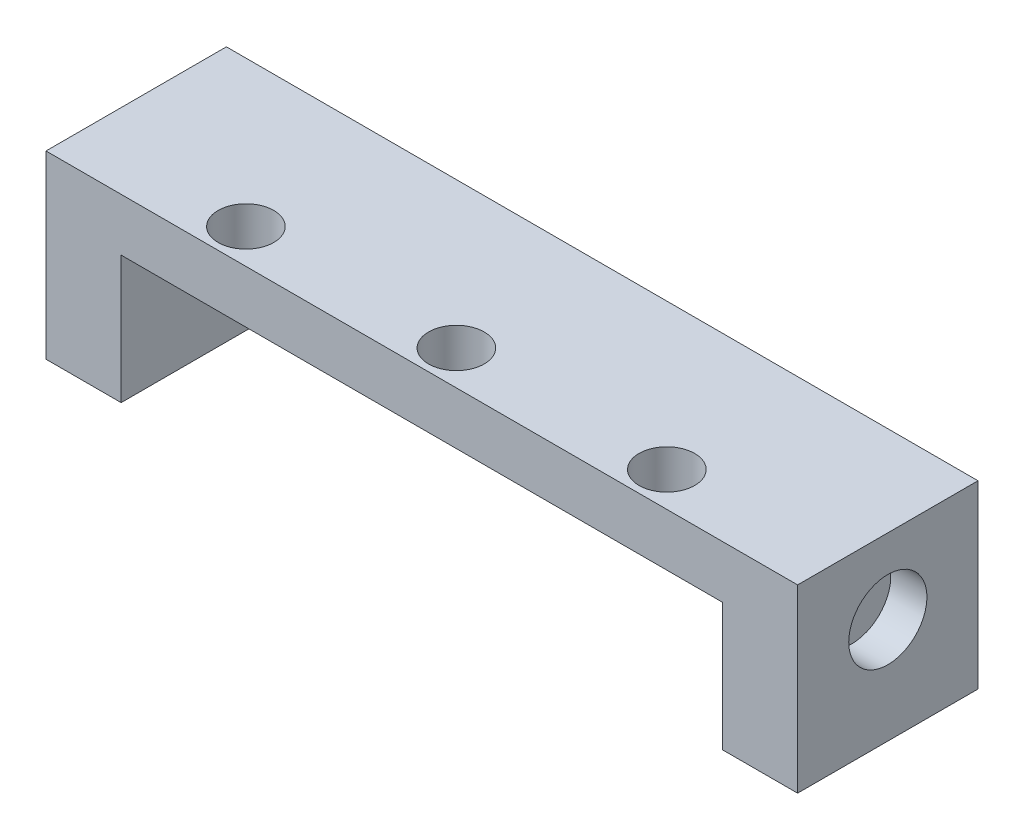
ISO-10303-21;
HEADER;
FILE_DESCRIPTION(('STEP AP214'),'2;1');
FILE_NAME('part.step','',(''),(''),'','','');
FILE_SCHEMA(('AUTOMOTIVE_DESIGN { 1 0 10303 214 1 1 1 1 }'));
ENDSEC;
DATA;
#1=APPLICATION_CONTEXT('core data for automotive mechanical design processes');
#2=APPLICATION_PROTOCOL_DEFINITION('international standard','automotive_design',2000,#1);
#3=PRODUCT_CONTEXT('',#1,'mechanical');
#4=PRODUCT('Part','Part','',(#3));
#5=PRODUCT_RELATED_PRODUCT_CATEGORY('part','',(#4));
#6=PRODUCT_DEFINITION_FORMATION('','',#4);
#7=PRODUCT_DEFINITION_CONTEXT('part definition',#1,'design');
#8=PRODUCT_DEFINITION('design','',#6,#7);
#9=PRODUCT_DEFINITION_SHAPE('','',#8);
#10=(LENGTH_UNIT() NAMED_UNIT(*) SI_UNIT(.MILLI.,.METRE.));
#11=(NAMED_UNIT(*) PLANE_ANGLE_UNIT() SI_UNIT($,.RADIAN.));
#12=(NAMED_UNIT(*) SI_UNIT($,.STERADIAN.) SOLID_ANGLE_UNIT());
#13=UNCERTAINTY_MEASURE_WITH_UNIT(LENGTH_MEASURE(1.E-05),#10,'distance_accuracy_value','');
#14=(GEOMETRIC_REPRESENTATION_CONTEXT(3) GLOBAL_UNCERTAINTY_ASSIGNED_CONTEXT((#13)) GLOBAL_UNIT_ASSIGNED_CONTEXT((#10,
#11,#12)) REPRESENTATION_CONTEXT('',''));
#15=CARTESIAN_POINT('',(0.,0.,0.));
#16=DIRECTION('',(0.,0.,1.));
#17=DIRECTION('',(1.,0.,0.));
#18=AXIS2_PLACEMENT_3D('',#15,#16,#17);
#19=CARTESIAN_POINT('',(0.,0.,12.));
#20=DIRECTION('',(0.,0.,-1.));
#21=DIRECTION('',(-1.,0.,0.));
#22=AXIS2_PLACEMENT_3D('',#19,#20,#21);
#23=PLANE('',#22);
#24=DIRECTION('',(-1.,0.,0.));
#25=VECTOR('',#24,1.);
#26=CARTESIAN_POINT('',(0.,59.,12.));
#27=LINE('',#26,#25);
#28=CARTESIAN_POINT('',(52.,59.,12.));
#29=VERTEX_POINT('',#28);
#30=CARTESIAN_POINT('',(2.,59.,12.));
#31=VERTEX_POINT('',#30);
#32=EDGE_CURVE('E11',#29,#31,#27,.T.);
#33=ORIENTED_EDGE('',*,*,#32,.T.);
#34=DIRECTION('',(0.,-1.,0.));
#35=VECTOR('',#34,1.);
#36=CARTESIAN_POINT('',(2.,59.,12.));
#37=LINE('',#36,#35);
#38=CARTESIAN_POINT('',(2.,47.,12.));
#39=VERTEX_POINT('',#38);
#40=EDGE_CURVE('E105',#31,#39,#37,.T.);
#41=ORIENTED_EDGE('',*,*,#40,.T.);
#42=DIRECTION('',(1.,0.,0.));
#43=VECTOR('',#42,1.);
#44=CARTESIAN_POINT('',(2.,47.,12.));
#45=LINE('',#44,#43);
#46=CARTESIAN_POINT('',(7.,47.,12.));
#47=VERTEX_POINT('',#46);
#48=EDGE_CURVE('E134',#39,#47,#45,.T.);
#49=ORIENTED_EDGE('',*,*,#48,.T.);
#50=DIRECTION('',(0.,-1.,0.));
#51=VECTOR('',#50,1.);
#52=CARTESIAN_POINT('',(7.,59.,12.));
#53=LINE('',#52,#51);
#54=CARTESIAN_POINT('',(7.,55.5,12.));
#55=VERTEX_POINT('',#54);
#56=EDGE_CURVE('E135',#55,#47,#53,.T.);
#57=ORIENTED_EDGE('',*,*,#56,.F.);
#58=DIRECTION('',(-1.,0.,0.));
#59=VECTOR('',#58,1.);
#60=CARTESIAN_POINT('',(7.,55.5,12.));
#61=LINE('',#60,#59);
#62=CARTESIAN_POINT('',(47.,55.5,12.));
#63=VERTEX_POINT('',#62);
#64=EDGE_CURVE('E193',#63,#55,#61,.T.);
#65=ORIENTED_EDGE('',*,*,#64,.F.);
#66=DIRECTION('',(0.,-1.,0.));
#67=VECTOR('',#66,1.);
#68=CARTESIAN_POINT('',(47.,59.,12.));
#69=LINE('',#68,#67);
#70=CARTESIAN_POINT('',(47.,47.,12.));
#71=VERTEX_POINT('',#70);
#72=EDGE_CURVE('E150',#63,#71,#69,.T.);
#73=ORIENTED_EDGE('',*,*,#72,.T.);
#74=DIRECTION('',(-1.,0.,0.));
#75=VECTOR('',#74,1.);
#76=CARTESIAN_POINT('',(52.,47.,12.));
#77=LINE('',#76,#75);
#78=CARTESIAN_POINT('',(52.,47.,12.));
#79=VERTEX_POINT('',#78);
#80=EDGE_CURVE('E176',#79,#71,#77,.T.);
#81=ORIENTED_EDGE('',*,*,#80,.F.);
#82=DIRECTION('',(0.,-1.,0.));
#83=VECTOR('',#82,1.);
#84=CARTESIAN_POINT('',(52.,59.,12.));
#85=LINE('',#84,#83);
#86=EDGE_CURVE('E109',#29,#79,#85,.T.);
#87=ORIENTED_EDGE('',*,*,#86,.F.);
#88=EDGE_LOOP('',(#33,#41,#49,#57,#65,#73,#81,#87));
#89=FACE_BOUND('',#88,.T.);
#90=ADVANCED_FACE('F39',(#89),#23,.F.);
#91=CARTESIAN_POINT('',(0.,0.,0.));
#92=DIRECTION('',(0.,0.,-1.));
#93=DIRECTION('',(-1.,0.,0.));
#94=AXIS2_PLACEMENT_3D('',#91,#92,#93);
#95=PLANE('',#94);
#96=DIRECTION('',(-1.,0.,0.));
#97=VECTOR('',#96,1.);
#98=CARTESIAN_POINT('',(7.,55.5,0.));
#99=LINE('',#98,#97);
#100=CARTESIAN_POINT('',(47.,55.5,0.));
#101=VERTEX_POINT('',#100);
#102=CARTESIAN_POINT('',(7.,55.5,0.));
#103=VERTEX_POINT('',#102);
#104=EDGE_CURVE('E197',#101,#103,#99,.T.);
#105=ORIENTED_EDGE('',*,*,#104,.T.);
#106=DIRECTION('',(0.,1.,0.));
#107=VECTOR('',#106,1.);
#108=CARTESIAN_POINT('',(7.,59.,0.));
#109=LINE('',#108,#107);
#110=CARTESIAN_POINT('',(7.,47.,0.));
#111=VERTEX_POINT('',#110);
#112=EDGE_CURVE('E138',#111,#103,#109,.T.);
#113=ORIENTED_EDGE('',*,*,#112,.F.);
#114=DIRECTION('',(1.,0.,0.));
#115=VECTOR('',#114,1.);
#116=CARTESIAN_POINT('',(2.,47.,0.));
#117=LINE('',#116,#115);
#118=CARTESIAN_POINT('',(2.,47.,0.));
#119=VERTEX_POINT('',#118);
#120=EDGE_CURVE('E147',#119,#111,#117,.T.);
#121=ORIENTED_EDGE('',*,*,#120,.F.);
#122=DIRECTION('',(0.,1.,0.));
#123=VECTOR('',#122,1.);
#124=CARTESIAN_POINT('',(2.,59.,0.));
#125=LINE('',#124,#123);
#126=CARTESIAN_POINT('',(2.,59.,0.));
#127=VERTEX_POINT('',#126);
#128=EDGE_CURVE('E126',#119,#127,#125,.T.);
#129=ORIENTED_EDGE('',*,*,#128,.T.);
#130=DIRECTION('',(-1.,0.,0.));
#131=VECTOR('',#130,1.);
#132=CARTESIAN_POINT('',(0.,59.,0.));
#133=LINE('',#132,#131);
#134=CARTESIAN_POINT('',(52.,59.,0.));
#135=VERTEX_POINT('',#134);
#136=EDGE_CURVE('E50',#135,#127,#133,.T.);
#137=ORIENTED_EDGE('',*,*,#136,.F.);
#138=DIRECTION('',(0.,1.,0.));
#139=VECTOR('',#138,1.);
#140=CARTESIAN_POINT('',(52.,59.,0.));
#141=LINE('',#140,#139);
#142=CARTESIAN_POINT('',(52.,47.,0.));
#143=VERTEX_POINT('',#142);
#144=EDGE_CURVE('E157',#143,#135,#141,.T.);
#145=ORIENTED_EDGE('',*,*,#144,.F.);
#146=DIRECTION('',(-1.,0.,0.));
#147=VECTOR('',#146,1.);
#148=CARTESIAN_POINT('',(52.,47.,0.));
#149=LINE('',#148,#147);
#150=CARTESIAN_POINT('',(47.,47.,0.));
#151=VERTEX_POINT('',#150);
#152=EDGE_CURVE('E164',#143,#151,#149,.T.);
#153=ORIENTED_EDGE('',*,*,#152,.T.);
#154=DIRECTION('',(0.,1.,0.));
#155=VECTOR('',#154,1.);
#156=CARTESIAN_POINT('',(47.,59.,0.));
#157=LINE('',#156,#155);
#158=EDGE_CURVE('E154',#151,#101,#157,.T.);
#159=ORIENTED_EDGE('',*,*,#158,.T.);
#160=EDGE_LOOP('',(#105,#113,#121,#129,#137,#145,#153,#159));
#161=FACE_BOUND('',#160,.T.);
#162=ADVANCED_FACE('F236',(#161),#95,.T.);
#163=CARTESIAN_POINT('',(0.,59.,12.));
#164=DIRECTION('',(0.,-1.,0.));
#165=DIRECTION('',(0.,0.,-1.));
#166=AXIS2_PLACEMENT_3D('',#163,#164,#165);
#167=PLANE('',#166);
#168=CARTESIAN_POINT('',(13.,59.,9.69999999999999));
#169=DIRECTION('',(0.,1.,0.));
#170=DIRECTION('',(-1.,0.,0.));
#171=AXIS2_PLACEMENT_3D('',#168,#169,#170);
#172=CIRCLE('',#171,1.85);
#173=CARTESIAN_POINT('',(11.15,59.,9.69999999999999));
#174=VERTEX_POINT('',#173);
#175=EDGE_CURVE('E181',#174,#174,#172,.T.);
#176=ORIENTED_EDGE('',*,*,#175,.F.);
#177=EDGE_LOOP('',(#176));
#178=FACE_BOUND('',#177,.T.);
#179=CARTESIAN_POINT('',(41.,59.0000000000002,9.69999999999999));
#180=DIRECTION('',(0.,1.,0.));
#181=DIRECTION('',(-1.,0.,0.));
#182=AXIS2_PLACEMENT_3D('',#179,#180,#181);
#183=CIRCLE('',#182,1.85);
#184=CARTESIAN_POINT('',(39.15,59.0000000000001,9.69999999999999));
#185=VERTEX_POINT('',#184);
#186=EDGE_CURVE('E186',#185,#185,#183,.T.);
#187=ORIENTED_EDGE('',*,*,#186,.F.);
#188=EDGE_LOOP('',(#187));
#189=FACE_BOUND('',#188,.T.);
#190=CARTESIAN_POINT('',(27.,59.0000000000001,9.69999999999999));
#191=DIRECTION('',(0.,1.,0.));
#192=DIRECTION('',(-1.,0.,0.));
#193=AXIS2_PLACEMENT_3D('',#190,#191,#192);
#194=CIRCLE('',#193,1.85);
#195=CARTESIAN_POINT('',(25.15,59.0000000000001,9.69999999999999));
#196=VERTEX_POINT('',#195);
#197=EDGE_CURVE('E180',#196,#196,#194,.T.);
#198=ORIENTED_EDGE('',*,*,#197,.F.);
#199=EDGE_LOOP('',(#198));
#200=FACE_BOUND('',#199,.T.);
#201=ORIENTED_EDGE('',*,*,#136,.T.);
#202=DIRECTION('',(0.,0.,1.));
#203=VECTOR('',#202,1.);
#204=CARTESIAN_POINT('',(2.,59.,12.));
#205=LINE('',#204,#203);
#206=EDGE_CURVE('E118',#127,#31,#205,.T.);
#207=ORIENTED_EDGE('',*,*,#206,.T.);
#208=ORIENTED_EDGE('',*,*,#32,.F.);
#209=DIRECTION('',(0.,0.,1.));
#210=VECTOR('',#209,1.);
#211=CARTESIAN_POINT('',(52.,59.,12.));
#212=LINE('',#211,#210);
#213=EDGE_CURVE('E161',#135,#29,#212,.T.);
#214=ORIENTED_EDGE('',*,*,#213,.F.);
#215=EDGE_LOOP('',(#201,#207,#208,#214));
#216=FACE_BOUND('',#215,.T.);
#217=ADVANCED_FACE('F41',(#178,#189,#200,#216),#167,.F.);
#218=CARTESIAN_POINT('',(7.,55.5,12.));
#219=DIRECTION('',(0.,-1.,0.));
#220=DIRECTION('',(0.,0.,-1.));
#221=AXIS2_PLACEMENT_3D('',#218,#219,#220);
#222=PLANE('',#221);
#223=CARTESIAN_POINT('',(13.,55.5,9.69999999999999));
#224=DIRECTION('',(0.,-1.,0.));
#225=DIRECTION('',(0.,0.,-1.));
#226=AXIS2_PLACEMENT_3D('',#223,#224,#225);
#227=CIRCLE('',#226,1.85);
#228=CARTESIAN_POINT('',(13.,55.5,7.84999999999999));
#229=VERTEX_POINT('',#228);
#230=EDGE_CURVE('E43',#229,#229,#227,.T.);
#231=ORIENTED_EDGE('',*,*,#230,.F.);
#232=EDGE_LOOP('',(#231));
#233=FACE_BOUND('',#232,.T.);
#234=CARTESIAN_POINT('',(41.,55.5,9.69999999999999));
#235=DIRECTION('',(0.,-1.,0.));
#236=DIRECTION('',(0.,0.,-1.));
#237=AXIS2_PLACEMENT_3D('',#234,#235,#236);
#238=CIRCLE('',#237,1.85);
#239=CARTESIAN_POINT('',(41.,55.5,7.84999999999999));
#240=VERTEX_POINT('',#239);
#241=EDGE_CURVE('E210',#240,#240,#238,.T.);
#242=ORIENTED_EDGE('',*,*,#241,.F.);
#243=EDGE_LOOP('',(#242));
#244=FACE_BOUND('',#243,.T.);
#245=CARTESIAN_POINT('',(27.,55.5,9.69999999999999));
#246=DIRECTION('',(0.,-1.,0.));
#247=DIRECTION('',(0.,0.,-1.));
#248=AXIS2_PLACEMENT_3D('',#245,#246,#247);
#249=CIRCLE('',#248,1.85);
#250=CARTESIAN_POINT('',(27.,55.5,7.84999999999999));
#251=VERTEX_POINT('',#250);
#252=EDGE_CURVE('E185',#251,#251,#249,.T.);
#253=ORIENTED_EDGE('',*,*,#252,.F.);
#254=EDGE_LOOP('',(#253));
#255=FACE_BOUND('',#254,.T.);
#256=ORIENTED_EDGE('',*,*,#104,.F.);
#257=DIRECTION('',(0.,0.,-1.));
#258=VECTOR('',#257,1.);
#259=CARTESIAN_POINT('',(47.,55.5,12.));
#260=LINE('',#259,#258);
#261=EDGE_CURVE('E57',#63,#101,#260,.T.);
#262=ORIENTED_EDGE('',*,*,#261,.F.);
#263=ORIENTED_EDGE('',*,*,#64,.T.);
#264=DIRECTION('',(0.,0.,-1.));
#265=VECTOR('',#264,1.);
#266=CARTESIAN_POINT('',(7.,55.5,12.));
#267=LINE('',#266,#265);
#268=EDGE_CURVE('E196',#55,#103,#267,.T.);
#269=ORIENTED_EDGE('',*,*,#268,.T.);
#270=EDGE_LOOP('',(#256,#262,#263,#269));
#271=FACE_BOUND('',#270,.T.);
#272=ADVANCED_FACE('F222',(#233,#244,#255,#271),#222,.T.);
#273=CARTESIAN_POINT('',(27.,49.0000000000001,9.69999999999999));
#274=DIRECTION('',(0.,1.,0.));
#275=DIRECTION('',(-1.,0.,0.));
#276=AXIS2_PLACEMENT_3D('',#273,#274,#275);
#277=CYLINDRICAL_SURFACE('',#276,1.85);
#278=ORIENTED_EDGE('',*,*,#252,.T.);
#279=EDGE_LOOP('',(#278));
#280=FACE_BOUND('',#279,.T.);
#281=ORIENTED_EDGE('',*,*,#197,.T.);
#282=EDGE_LOOP('',(#281));
#283=FACE_BOUND('',#282,.T.);
#284=ADVANCED_FACE('F225',(#280,#283),#277,.F.);
#285=CARTESIAN_POINT('',(41.,49.0000000000002,9.69999999999999));
#286=DIRECTION('',(0.,1.,0.));
#287=DIRECTION('',(-1.,0.,0.));
#288=AXIS2_PLACEMENT_3D('',#285,#286,#287);
#289=CYLINDRICAL_SURFACE('',#288,1.85);
#290=ORIENTED_EDGE('',*,*,#241,.T.);
#291=EDGE_LOOP('',(#290));
#292=FACE_BOUND('',#291,.T.);
#293=ORIENTED_EDGE('',*,*,#186,.T.);
#294=EDGE_LOOP('',(#293));
#295=FACE_BOUND('',#294,.T.);
#296=ADVANCED_FACE('F267',(#292,#295),#289,.F.);
#297=CARTESIAN_POINT('',(13.,49.,9.69999999999999));
#298=DIRECTION('',(0.,1.,0.));
#299=DIRECTION('',(-1.,0.,0.));
#300=AXIS2_PLACEMENT_3D('',#297,#298,#299);
#301=CYLINDRICAL_SURFACE('',#300,1.85);
#302=ORIENTED_EDGE('',*,*,#230,.T.);
#303=EDGE_LOOP('',(#302));
#304=FACE_BOUND('',#303,.T.);
#305=ORIENTED_EDGE('',*,*,#175,.T.);
#306=EDGE_LOOP('',(#305));
#307=FACE_BOUND('',#306,.T.);
#308=ADVANCED_FACE('F219',(#304,#307),#301,.F.);
#309=CARTESIAN_POINT('',(47.,0.,0.));
#310=DIRECTION('',(1.,0.,0.));
#311=DIRECTION('',(0.,0.,-1.));
#312=AXIS2_PLACEMENT_3D('',#309,#310,#311);
#313=PLANE('',#312);
#314=ORIENTED_EDGE('',*,*,#72,.F.);
#315=ORIENTED_EDGE('',*,*,#261,.T.);
#316=ORIENTED_EDGE('',*,*,#158,.F.);
#317=DIRECTION('',(0.,0.,-1.));
#318=VECTOR('',#317,1.);
#319=CARTESIAN_POINT('',(47.,47.,12.));
#320=LINE('',#319,#318);
#321=EDGE_CURVE('E167',#71,#151,#320,.T.);
#322=ORIENTED_EDGE('',*,*,#321,.F.);
#323=EDGE_LOOP('',(#314,#315,#316,#322));
#324=FACE_BOUND('',#323,.T.);
#325=ADVANCED_FACE('F234',(#324),#313,.F.);
#326=CARTESIAN_POINT('',(52.,47.,12.));
#327=DIRECTION('',(0.,1.,0.));
#328=DIRECTION('',(0.,0.,1.));
#329=AXIS2_PLACEMENT_3D('',#326,#327,#328);
#330=PLANE('',#329);
#331=ORIENTED_EDGE('',*,*,#321,.T.);
#332=ORIENTED_EDGE('',*,*,#152,.F.);
#333=DIRECTION('',(0.,0.,-1.));
#334=VECTOR('',#333,1.);
#335=CARTESIAN_POINT('',(52.,47.,12.));
#336=LINE('',#335,#334);
#337=EDGE_CURVE('E153',#79,#143,#336,.T.);
#338=ORIENTED_EDGE('',*,*,#337,.F.);
#339=ORIENTED_EDGE('',*,*,#80,.T.);
#340=EDGE_LOOP('',(#331,#332,#338,#339));
#341=FACE_BOUND('',#340,.T.);
#342=ADVANCED_FACE('F240',(#341),#330,.F.);
#343=CARTESIAN_POINT('',(52.,0.,0.));
#344=DIRECTION('',(1.,0.,0.));
#345=DIRECTION('',(0.,0.,-1.));
#346=AXIS2_PLACEMENT_3D('',#343,#344,#345);
#347=PLANE('',#346);
#348=CARTESIAN_POINT('',(52.,54.,6.));
#349=DIRECTION('',(-1.,0.,0.));
#350=DIRECTION('',(0.,0.,1.));
#351=AXIS2_PLACEMENT_3D('',#348,#349,#350);
#352=CIRCLE('',#351,2.6);
#353=CARTESIAN_POINT('',(52.,54.,8.6));
#354=VERTEX_POINT('',#353);
#355=EDGE_CURVE('E431',#354,#354,#352,.T.);
#356=ORIENTED_EDGE('',*,*,#355,.T.);
#357=EDGE_LOOP('',(#356));
#358=FACE_BOUND('',#357,.T.);
#359=ORIENTED_EDGE('',*,*,#86,.T.);
#360=ORIENTED_EDGE('',*,*,#337,.T.);
#361=ORIENTED_EDGE('',*,*,#144,.T.);
#362=ORIENTED_EDGE('',*,*,#213,.T.);
#363=EDGE_LOOP('',(#359,#360,#361,#362));
#364=FACE_BOUND('',#363,.T.);
#365=ADVANCED_FACE('F248',(#358,#364),#347,.T.);
#366=CARTESIAN_POINT('',(2.,47.,12.));
#367=DIRECTION('',(0.,-1.,0.));
#368=DIRECTION('',(0.,0.,-1.));
#369=AXIS2_PLACEMENT_3D('',#366,#367,#368);
#370=PLANE('',#369);
#371=DIRECTION('',(0.,0.,-1.));
#372=VECTOR('',#371,1.);
#373=CARTESIAN_POINT('',(7.,47.,12.));
#374=LINE('',#373,#372);
#375=EDGE_CURVE('E123',#47,#111,#374,.T.);
#376=ORIENTED_EDGE('',*,*,#375,.F.);
#377=ORIENTED_EDGE('',*,*,#48,.F.);
#378=DIRECTION('',(0.,0.,-1.));
#379=VECTOR('',#378,1.);
#380=CARTESIAN_POINT('',(2.,47.,12.));
#381=LINE('',#380,#379);
#382=EDGE_CURVE('E121',#39,#119,#381,.T.);
#383=ORIENTED_EDGE('',*,*,#382,.T.);
#384=ORIENTED_EDGE('',*,*,#120,.T.);
#385=EDGE_LOOP('',(#376,#377,#383,#384));
#386=FACE_BOUND('',#385,.T.);
#387=ADVANCED_FACE('F246',(#386),#370,.T.);
#388=CARTESIAN_POINT('',(2.,0.,0.));
#389=DIRECTION('',(-1.,0.,0.));
#390=DIRECTION('',(0.,0.,-1.));
#391=AXIS2_PLACEMENT_3D('',#388,#389,#390);
#392=PLANE('',#391);
#393=CARTESIAN_POINT('',(2.,54.,5.99999999999999));
#394=DIRECTION('',(-1.,0.,0.));
#395=DIRECTION('',(0.,0.,1.));
#396=AXIS2_PLACEMENT_3D('',#393,#394,#395);
#397=CIRCLE('',#396,2.6);
#398=CARTESIAN_POINT('',(2.,54.,8.59999999999999));
#399=VERTEX_POINT('',#398);
#400=EDGE_CURVE('E424',#399,#399,#397,.T.);
#401=ORIENTED_EDGE('',*,*,#400,.F.);
#402=EDGE_LOOP('',(#401));
#403=FACE_BOUND('',#402,.T.);
#404=ORIENTED_EDGE('',*,*,#40,.F.);
#405=ORIENTED_EDGE('',*,*,#206,.F.);
#406=ORIENTED_EDGE('',*,*,#128,.F.);
#407=ORIENTED_EDGE('',*,*,#382,.F.);
#408=EDGE_LOOP('',(#404,#405,#406,#407));
#409=FACE_BOUND('',#408,.T.);
#410=ADVANCED_FACE('F116',(#403,#409),#392,.T.);
#411=CARTESIAN_POINT('',(7.,0.,0.));
#412=DIRECTION('',(-1.,0.,0.));
#413=DIRECTION('',(0.,0.,-1.));
#414=AXIS2_PLACEMENT_3D('',#411,#412,#413);
#415=PLANE('',#414);
#416=ORIENTED_EDGE('',*,*,#268,.F.);
#417=ORIENTED_EDGE('',*,*,#56,.T.);
#418=ORIENTED_EDGE('',*,*,#375,.T.);
#419=ORIENTED_EDGE('',*,*,#112,.T.);
#420=EDGE_LOOP('',(#416,#417,#418,#419));
#421=FACE_BOUND('',#420,.T.);
#422=ADVANCED_FACE('F244',(#421),#415,.F.);
#423=CARTESIAN_POINT('',(4.4,54.,5.99999999999999));
#424=DIRECTION('',(-1.,0.,0.));
#425=DIRECTION('',(0.,0.,1.));
#426=AXIS2_PLACEMENT_3D('',#423,#424,#425);
#427=CYLINDRICAL_SURFACE('',#426,2.6);
#428=CARTESIAN_POINT('',(4.4,54.,5.99999999999999));
#429=DIRECTION('',(-1.,0.,0.));
#430=DIRECTION('',(0.,0.,1.));
#431=AXIS2_PLACEMENT_3D('',#428,#429,#430);
#432=CIRCLE('',#431,2.6);
#433=CARTESIAN_POINT('',(4.4,54.,8.59999999999999));
#434=VERTEX_POINT('',#433);
#435=EDGE_CURVE('E139',#434,#434,#432,.T.);
#436=ORIENTED_EDGE('',*,*,#435,.F.);
#437=EDGE_LOOP('',(#436));
#438=FACE_BOUND('',#437,.T.);
#439=ORIENTED_EDGE('',*,*,#400,.T.);
#440=EDGE_LOOP('',(#439));
#441=FACE_BOUND('',#440,.T.);
#442=ADVANCED_FACE('F322',(#438,#441),#427,.F.);
#443=CARTESIAN_POINT('',(4.4,54.,5.99999999999999));
#444=DIRECTION('',(-1.,0.,0.));
#445=DIRECTION('',(0.,0.,1.));
#446=AXIS2_PLACEMENT_3D('',#443,#444,#445);
#447=PLANE('',#446);
#448=ORIENTED_EDGE('',*,*,#435,.T.);
#449=EDGE_LOOP('',(#448));
#450=FACE_BOUND('',#449,.T.);
#451=ADVANCED_FACE('F295',(#450),#447,.T.);
#452=CARTESIAN_POINT('',(49.6,54.,6.));
#453=DIRECTION('',(1.,0.,0.));
#454=DIRECTION('',(0.,0.,-1.));
#455=AXIS2_PLACEMENT_3D('',#452,#453,#454);
#456=CYLINDRICAL_SURFACE('',#455,2.6);
#457=CARTESIAN_POINT('',(49.6,54.,6.));
#458=DIRECTION('',(-1.,0.,0.));
#459=DIRECTION('',(0.,0.,1.));
#460=AXIS2_PLACEMENT_3D('',#457,#458,#459);
#461=CIRCLE('',#460,2.6);
#462=CARTESIAN_POINT('',(49.6,54.,8.6));
#463=VERTEX_POINT('',#462);
#464=EDGE_CURVE('E426',#463,#463,#461,.T.);
#465=ORIENTED_EDGE('',*,*,#464,.T.);
#466=EDGE_LOOP('',(#465));
#467=FACE_BOUND('',#466,.T.);
#468=ORIENTED_EDGE('',*,*,#355,.F.);
#469=EDGE_LOOP('',(#468));
#470=FACE_BOUND('',#469,.T.);
#471=ADVANCED_FACE('F300',(#467,#470),#456,.F.);
#472=CARTESIAN_POINT('',(49.6,54.,6.));
#473=DIRECTION('',(1.,0.,0.));
#474=DIRECTION('',(0.,0.,1.));
#475=AXIS2_PLACEMENT_3D('',#472,#473,#474);
#476=PLANE('',#475);
#477=ORIENTED_EDGE('',*,*,#464,.F.);
#478=EDGE_LOOP('',(#477));
#479=FACE_BOUND('',#478,.T.);
#480=ADVANCED_FACE('F305',(#479),#476,.T.);
#481=CLOSED_SHELL('',(#90,#162,#217,#272,#284,#296,#308,#325,#342,#365,#387,#410,#422,#442,#451,
#471,#480));
#482=MANIFOLD_SOLID_BREP('B2',#481);
#483=ADVANCED_BREP_SHAPE_REPRESENTATION('',(#18,#482),#14);
#484=SHAPE_DEFINITION_REPRESENTATION(#9,#483);
ENDSEC;
END-ISO-10303-21;
